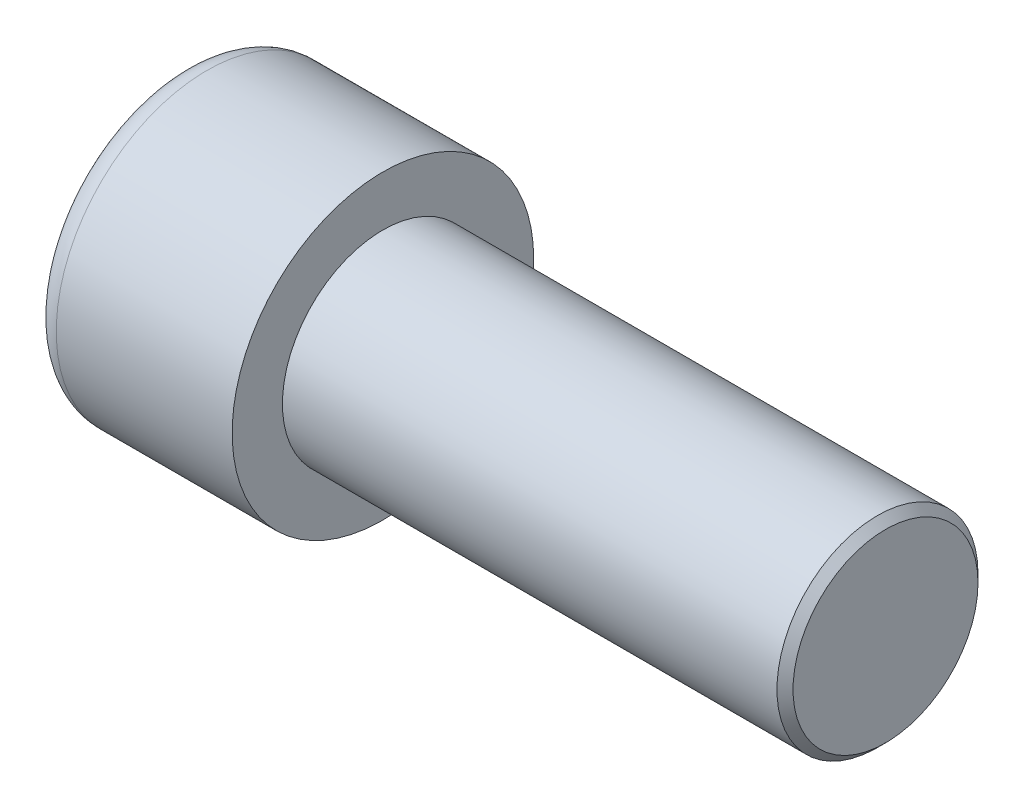
ISO-10303-21;
HEADER;
FILE_DESCRIPTION(('STEP AP214'),'2;1');
FILE_NAME('part.step','',(''),(''),'','','');
FILE_SCHEMA(('AUTOMOTIVE_DESIGN { 1 0 10303 214 1 1 1 1 }'));
ENDSEC;
DATA;
#1=APPLICATION_CONTEXT('core data for automotive mechanical design processes');
#2=APPLICATION_PROTOCOL_DEFINITION('international standard','automotive_design',2000,#1);
#3=PRODUCT_CONTEXT('',#1,'mechanical');
#4=PRODUCT('Part','Part','',(#3));
#5=PRODUCT_RELATED_PRODUCT_CATEGORY('part','',(#4));
#6=PRODUCT_DEFINITION_FORMATION('','',#4);
#7=PRODUCT_DEFINITION_CONTEXT('part definition',#1,'design');
#8=PRODUCT_DEFINITION('design','',#6,#7);
#9=PRODUCT_DEFINITION_SHAPE('','',#8);
#10=(LENGTH_UNIT() NAMED_UNIT(*) SI_UNIT(.MILLI.,.METRE.));
#11=(NAMED_UNIT(*) PLANE_ANGLE_UNIT() SI_UNIT($,.RADIAN.));
#12=(NAMED_UNIT(*) SI_UNIT($,.STERADIAN.) SOLID_ANGLE_UNIT());
#13=UNCERTAINTY_MEASURE_WITH_UNIT(LENGTH_MEASURE(1.E-05),#10,'distance_accuracy_value','');
#14=(GEOMETRIC_REPRESENTATION_CONTEXT(3) GLOBAL_UNCERTAINTY_ASSIGNED_CONTEXT((#13)) GLOBAL_UNIT_ASSIGNED_CONTEXT((#10,
#11,#12)) REPRESENTATION_CONTEXT('',''));
#15=CARTESIAN_POINT('',(0.,0.,0.));
#16=DIRECTION('',(0.,0.,1.));
#17=DIRECTION('',(1.,0.,0.));
#18=AXIS2_PLACEMENT_3D('',#15,#16,#17);
#19=CARTESIAN_POINT('',(6.14277124869768,-17.4264788643518,-0.68643311876925));
#20=DIRECTION('',(-1.,0.,0.));
#21=DIRECTION('',(0.,0.,1.));
#22=AXIS2_PLACEMENT_3D('',#19,#20,#21);
#23=PLANE('',#22);
#24=DIRECTION('',(0.,-0.866025403784438,-0.5));
#25=VECTOR('',#24,1.);
#26=CARTESIAN_POINT('',(6.14277124869768,-0.426478864351765,9.12852145745439));
#27=LINE('',#26,#25);
#28=CARTESIAN_POINT('',(6.14277124869768,-4.67647886435177,6.67478281339848));
#29=VERTEX_POINT('',#28);
#30=CARTESIAN_POINT('',(6.14277124869768,-8.92647886435176,4.22104416934257));
#31=VERTEX_POINT('',#30);
#32=EDGE_CURVE('E137',#29,#31,#27,.T.);
#33=ORIENTED_EDGE('',*,*,#32,.F.);
#34=CARTESIAN_POINT('',(6.14277124869768,-0.426478864351765,-0.686433118769258));
#35=DIRECTION('',(-1.,0.,0.));
#36=DIRECTION('',(0.,0.,1.));
#37=AXIS2_PLACEMENT_3D('',#34,#35,#36);
#38=CIRCLE('',#37,8.49999999999999);
#39=CARTESIAN_POINT('',(6.14277124869768,-8.92647886435176,-0.686433118769258));
#40=VERTEX_POINT('',#39);
#41=EDGE_CURVE('E33',#29,#40,#38,.F.);
#42=ORIENTED_EDGE('',*,*,#41,.T.);
#43=DIRECTION('',(0.,0.,-1.));
#44=VECTOR('',#43,1.);
#45=CARTESIAN_POINT('',(6.14277124869768,-8.92647886435176,4.22104416934257));
#46=LINE('',#45,#44);
#47=EDGE_CURVE('E143',#31,#40,#46,.T.);
#48=ORIENTED_EDGE('',*,*,#47,.F.);
#49=EDGE_LOOP('',(#33,#42,#48));
#50=FACE_BOUND('',#49,.T.);
#51=ADVANCED_FACE('F16',(#50),#23,.T.);
#52=CARTESIAN_POINT('',(6.14277124869768,-8.92647886435176,-5.59391040688107));
#53=VERTEX_POINT('',#52);
#54=EDGE_CURVE('E138',#40,#53,#46,.T.);
#55=ORIENTED_EDGE('',*,*,#54,.F.);
#56=CARTESIAN_POINT('',(6.14277124869768,-4.67647886435176,-8.04764905093699));
#57=VERTEX_POINT('',#56);
#58=EDGE_CURVE('E116',#40,#57,#38,.F.);
#59=ORIENTED_EDGE('',*,*,#58,.T.);
#60=DIRECTION('',(0.,0.866025403784439,-0.5));
#61=VECTOR('',#60,1.);
#62=CARTESIAN_POINT('',(6.14277124869768,-8.92647886435176,-5.59391040688107));
#63=LINE('',#62,#61);
#64=EDGE_CURVE('E123',#53,#57,#63,.T.);
#65=ORIENTED_EDGE('',*,*,#64,.F.);
#66=EDGE_LOOP('',(#55,#59,#65));
#67=FACE_BOUND('',#66,.T.);
#68=ADVANCED_FACE('F196',(#67),#23,.T.);
#69=CARTESIAN_POINT('',(6.14277124869768,-0.426478864351765,-10.5013876949929));
#70=VERTEX_POINT('',#69);
#71=EDGE_CURVE('E111',#57,#70,#63,.T.);
#72=ORIENTED_EDGE('',*,*,#71,.F.);
#73=CARTESIAN_POINT('',(6.14277124869768,3.82352113564824,-8.04764905093698));
#74=VERTEX_POINT('',#73);
#75=EDGE_CURVE('E98',#57,#74,#38,.F.);
#76=ORIENTED_EDGE('',*,*,#75,.T.);
#77=DIRECTION('',(0.,0.866025403784438,0.5));
#78=VECTOR('',#77,1.);
#79=CARTESIAN_POINT('',(6.14277124869768,-0.426478864351765,-10.5013876949929));
#80=LINE('',#79,#78);
#81=EDGE_CURVE('E115',#70,#74,#80,.T.);
#82=ORIENTED_EDGE('',*,*,#81,.F.);
#83=EDGE_LOOP('',(#72,#76,#82));
#84=FACE_BOUND('',#83,.T.);
#85=ADVANCED_FACE('F109',(#84),#23,.T.);
#86=CARTESIAN_POINT('',(6.14277124869768,8.07352113564824,-5.59391040688106));
#87=VERTEX_POINT('',#86);
#88=EDGE_CURVE('E119',#74,#87,#80,.T.);
#89=ORIENTED_EDGE('',*,*,#88,.F.);
#90=CARTESIAN_POINT('',(6.14277124869768,-0.426478864351765,-0.686433118769258));
#91=DIRECTION('',(1.,0.,0.));
#92=DIRECTION('',(0.,0.,-1.));
#93=AXIS2_PLACEMENT_3D('',#90,#91,#92);
#94=CIRCLE('',#93,8.5);
#95=CARTESIAN_POINT('',(6.14277124869768,8.07352113564823,-0.686433118769258));
#96=VERTEX_POINT('',#95);
#97=EDGE_CURVE('E96',#74,#96,#94,.T.);
#98=ORIENTED_EDGE('',*,*,#97,.T.);
#99=DIRECTION('',(0.,0.,1.));
#100=VECTOR('',#99,1.);
#101=CARTESIAN_POINT('',(6.14277124869768,8.07352113564824,-5.59391040688106));
#102=LINE('',#101,#100);
#103=EDGE_CURVE('E124',#87,#96,#102,.T.);
#104=ORIENTED_EDGE('',*,*,#103,.F.);
#105=EDGE_LOOP('',(#89,#98,#104));
#106=FACE_BOUND('',#105,.T.);
#107=ADVANCED_FACE('F118',(#106),#23,.T.);
#108=CARTESIAN_POINT('',(6.14277124869768,8.07352113564824,4.22104416934257));
#109=VERTEX_POINT('',#108);
#110=EDGE_CURVE('E128',#96,#109,#102,.T.);
#111=ORIENTED_EDGE('',*,*,#110,.F.);
#112=CARTESIAN_POINT('',(6.14277124869768,3.82352113564824,6.67478281339847));
#113=VERTEX_POINT('',#112);
#114=EDGE_CURVE('E101',#96,#113,#38,.F.);
#115=ORIENTED_EDGE('',*,*,#114,.T.);
#116=DIRECTION('',(0.,-0.866025403784439,0.5));
#117=VECTOR('',#116,1.);
#118=CARTESIAN_POINT('',(6.14277124869768,8.07352113564824,4.22104416934257));
#119=LINE('',#118,#117);
#120=EDGE_CURVE('E132',#109,#113,#119,.T.);
#121=ORIENTED_EDGE('',*,*,#120,.F.);
#122=EDGE_LOOP('',(#111,#115,#121));
#123=FACE_BOUND('',#122,.T.);
#124=ADVANCED_FACE('F209',(#123),#23,.T.);
#125=CARTESIAN_POINT('',(6.14277124869768,-0.426478864351765,9.12852145745439));
#126=VERTEX_POINT('',#125);
#127=EDGE_CURVE('E135',#113,#126,#119,.T.);
#128=ORIENTED_EDGE('',*,*,#127,.F.);
#129=EDGE_CURVE('E176',#113,#29,#38,.F.);
#130=ORIENTED_EDGE('',*,*,#129,.T.);
#131=EDGE_CURVE('E140',#126,#29,#27,.T.);
#132=ORIENTED_EDGE('',*,*,#131,.F.);
#133=EDGE_LOOP('',(#128,#130,#132));
#134=FACE_BOUND('',#133,.T.);
#135=ADVANCED_FACE('F203',(#134),#23,.T.);
#136=CARTESIAN_POINT('',(-3.85722875130232,-0.426478864351765,-0.686433118769258));
#137=DIRECTION('',(1.,0.,0.));
#138=DIRECTION('',(0.,0.,-1.));
#139=AXIS2_PLACEMENT_3D('',#136,#137,#138);
#140=PLANE('',#139);
#141=CARTESIAN_POINT('',(-3.85722875130232,-0.426478864351765,-0.686433118769258));
#142=DIRECTION('',(1.,0.,0.));
#143=DIRECTION('',(0.,0.,-1.));
#144=AXIS2_PLACEMENT_3D('',#141,#142,#143);
#145=CIRCLE('',#144,12.5);
#146=CARTESIAN_POINT('',(-3.85722875130232,-0.426478864351765,-13.1864331187693));
#147=VERTEX_POINT('',#146);
#148=EDGE_CURVE('E181',#147,#147,#145,.F.);
#149=ORIENTED_EDGE('',*,*,#148,.T.);
#150=EDGE_LOOP('',(#149));
#151=FACE_BOUND('',#150,.T.);
#152=DIRECTION('',(0.,0.866025403784439,-0.5));
#153=VECTOR('',#152,1.);
#154=CARTESIAN_POINT('',(-3.85722875130232,-8.92647886435176,-5.59391040688107));
#155=LINE('',#154,#153);
#156=CARTESIAN_POINT('',(-3.85722875130232,-8.92647886435176,-5.59391040688107));
#157=VERTEX_POINT('',#156);
#158=CARTESIAN_POINT('',(-3.85722875130232,-0.426478864351765,-10.5013876949929));
#159=VERTEX_POINT('',#158);
#160=EDGE_CURVE('E39',#157,#159,#155,.T.);
#161=ORIENTED_EDGE('',*,*,#160,.T.);
#162=DIRECTION('',(0.,0.866025403784438,0.5));
#163=VECTOR('',#162,1.);
#164=CARTESIAN_POINT('',(-3.85722875130232,-0.426478864351765,-10.5013876949929));
#165=LINE('',#164,#163);
#166=CARTESIAN_POINT('',(-3.85722875130232,8.07352113564824,-5.59391040688106));
#167=VERTEX_POINT('',#166);
#168=EDGE_CURVE('E148',#159,#167,#165,.T.);
#169=ORIENTED_EDGE('',*,*,#168,.T.);
#170=DIRECTION('',(0.,0.,1.));
#171=VECTOR('',#170,1.);
#172=CARTESIAN_POINT('',(-3.85722875130232,8.07352113564824,-5.59391040688106));
#173=LINE('',#172,#171);
#174=CARTESIAN_POINT('',(-3.85722875130232,8.07352113564824,4.22104416934257));
#175=VERTEX_POINT('',#174);
#176=EDGE_CURVE('E149',#167,#175,#173,.T.);
#177=ORIENTED_EDGE('',*,*,#176,.T.);
#178=DIRECTION('',(0.,-0.866025403784439,0.5));
#179=VECTOR('',#178,1.);
#180=CARTESIAN_POINT('',(-3.85722875130232,8.07352113564824,4.22104416934257));
#181=LINE('',#180,#179);
#182=CARTESIAN_POINT('',(-3.85722875130232,-0.426478864351765,9.12852145745439));
#183=VERTEX_POINT('',#182);
#184=EDGE_CURVE('E155',#175,#183,#181,.T.);
#185=ORIENTED_EDGE('',*,*,#184,.T.);
#186=DIRECTION('',(0.,-0.866025403784438,-0.5));
#187=VECTOR('',#186,1.);
#188=CARTESIAN_POINT('',(-3.85722875130232,-0.426478864351765,9.12852145745439));
#189=LINE('',#188,#187);
#190=CARTESIAN_POINT('',(-3.85722875130232,-8.92647886435176,4.22104416934257));
#191=VERTEX_POINT('',#190);
#192=EDGE_CURVE('E154',#183,#191,#189,.T.);
#193=ORIENTED_EDGE('',*,*,#192,.T.);
#194=DIRECTION('',(0.,0.,-1.));
#195=VECTOR('',#194,1.);
#196=CARTESIAN_POINT('',(-3.85722875130232,-8.92647886435176,4.22104416934257));
#197=LINE('',#196,#195);
#198=EDGE_CURVE('E158',#191,#157,#197,.T.);
#199=ORIENTED_EDGE('',*,*,#198,.T.);
#200=EDGE_LOOP('',(#161,#169,#177,#185,#193,#199));
#201=FACE_BOUND('',#200,.T.);
#202=ADVANCED_FACE('F207',(#151,#201),#140,.F.);
#203=CARTESIAN_POINT('',(16.1427712486977,-0.426478864351765,-0.686433118769258));
#204=DIRECTION('',(1.,0.,0.));
#205=DIRECTION('',(0.,0.,-1.));
#206=AXIS2_PLACEMENT_3D('',#203,#204,#205);
#207=PLANE('',#206);
#208=CARTESIAN_POINT('',(16.1427712486977,-0.426478864351765,-0.686433118769258));
#209=DIRECTION('',(1.,0.,0.));
#210=DIRECTION('',(0.,0.,-1.));
#211=AXIS2_PLACEMENT_3D('',#208,#209,#210);
#212=CIRCLE('',#211,15.);
#213=CARTESIAN_POINT('',(16.1427712486977,-0.426478864351765,-15.6864331187693));
#214=VERTEX_POINT('',#213);
#215=EDGE_CURVE('E173',#214,#214,#212,.T.);
#216=ORIENTED_EDGE('',*,*,#215,.T.);
#217=EDGE_LOOP('',(#216));
#218=FACE_BOUND('',#217,.T.);
#219=CARTESIAN_POINT('',(16.1427712486977,-0.426478864351765,-0.686433118769258));
#220=DIRECTION('',(1.,0.,0.));
#221=DIRECTION('',(0.,0.,-1.));
#222=AXIS2_PLACEMENT_3D('',#219,#220,#221);
#223=CIRCLE('',#222,10.);
#224=CARTESIAN_POINT('',(16.1427712486977,-0.426478864351765,-10.6864331187693));
#225=VERTEX_POINT('',#224);
#226=EDGE_CURVE('E171',#225,#225,#223,.T.);
#227=ORIENTED_EDGE('',*,*,#226,.F.);
#228=EDGE_LOOP('',(#227));
#229=FACE_BOUND('',#228,.T.);
#230=ADVANCED_FACE('F216',(#218,#229),#207,.T.);
#231=CARTESIAN_POINT('',(16.1427712486977,-0.426478864351765,-0.686433118769258));
#232=DIRECTION('',(-1.,0.,0.));
#233=DIRECTION('',(0.,0.,1.));
#234=AXIS2_PLACEMENT_3D('',#231,#232,#233);
#235=CYLINDRICAL_SURFACE('',#234,15.);
#236=CARTESIAN_POINT('',(-1.35722875130232,-0.426478864351765,-0.686433118769258));
#237=DIRECTION('',(1.,0.,0.));
#238=DIRECTION('',(0.,0.,-1.));
#239=AXIS2_PLACEMENT_3D('',#236,#237,#238);
#240=CIRCLE('',#239,15.);
#241=CARTESIAN_POINT('',(-1.35722875130232,-0.426478864351765,-15.6864331187693));
#242=VERTEX_POINT('',#241);
#243=EDGE_CURVE('E178',#242,#242,#240,.T.);
#244=ORIENTED_EDGE('',*,*,#243,.T.);
#245=EDGE_LOOP('',(#244));
#246=FACE_BOUND('',#245,.T.);
#247=ORIENTED_EDGE('',*,*,#215,.F.);
#248=EDGE_LOOP('',(#247));
#249=FACE_BOUND('',#248,.T.);
#250=ADVANCED_FACE('F261',(#246,#249),#235,.T.);
#251=CARTESIAN_POINT('',(66.1427712486977,-0.426478864351765,-0.686433118769258));
#252=DIRECTION('',(-1.,0.,0.));
#253=DIRECTION('',(0.,0.,1.));
#254=AXIS2_PLACEMENT_3D('',#251,#252,#253);
#255=CYLINDRICAL_SURFACE('',#254,10.);
#256=CARTESIAN_POINT('',(65.3427712486977,-0.426478864351765,-0.686433118769258));
#257=DIRECTION('',(1.,0.,0.));
#258=DIRECTION('',(0.,0.,-1.));
#259=AXIS2_PLACEMENT_3D('',#256,#257,#258);
#260=CIRCLE('',#259,10.);
#261=CARTESIAN_POINT('',(65.3427712486977,-0.426478864351765,-10.6864331187693));
#262=VERTEX_POINT('',#261);
#263=EDGE_CURVE('E10',#262,#262,#260,.F.);
#264=ORIENTED_EDGE('',*,*,#263,.T.);
#265=EDGE_LOOP('',(#264));
#266=FACE_BOUND('',#265,.T.);
#267=ORIENTED_EDGE('',*,*,#226,.T.);
#268=EDGE_LOOP('',(#267));
#269=FACE_BOUND('',#268,.T.);
#270=ADVANCED_FACE('F256',(#266,#269),#255,.T.);
#271=CARTESIAN_POINT('',(66.1427712486977,-0.426478864351765,-0.686433118769258));
#272=DIRECTION('',(1.,0.,0.));
#273=DIRECTION('',(0.,0.,-1.));
#274=AXIS2_PLACEMENT_3D('',#271,#272,#273);
#275=PLANE('',#274);
#276=CARTESIAN_POINT('',(66.1427712486977,-0.426478864351765,-0.686433118769258));
#277=DIRECTION('',(1.,0.,0.));
#278=DIRECTION('',(0.,0.,-1.));
#279=AXIS2_PLACEMENT_3D('',#276,#277,#278);
#280=CIRCLE('',#279,9.20000000000001);
#281=CARTESIAN_POINT('',(66.1427712486977,-0.426478864351765,-9.88643311876926));
#282=VERTEX_POINT('',#281);
#283=EDGE_CURVE('E24',#282,#282,#280,.T.);
#284=ORIENTED_EDGE('',*,*,#283,.T.);
#285=EDGE_LOOP('',(#284));
#286=FACE_BOUND('',#285,.T.);
#287=ADVANCED_FACE('F190',(#286),#275,.T.);
#288=CARTESIAN_POINT('',(6.14277124869768,-8.92647886435176,-5.59391040688107));
#289=DIRECTION('',(0.,0.5,0.866025403784439));
#290=DIRECTION('',(0.,-0.866025403784439,0.5));
#291=AXIS2_PLACEMENT_3D('',#288,#289,#290);
#292=PLANE('',#291);
#293=ORIENTED_EDGE('',*,*,#160,.F.);
#294=DIRECTION('',(-1.,0.,0.));
#295=VECTOR('',#294,1.);
#296=CARTESIAN_POINT('',(6.14277124869768,-8.92647886435176,-5.59391040688107));
#297=LINE('',#296,#295);
#298=EDGE_CURVE('E145',#53,#157,#297,.T.);
#299=ORIENTED_EDGE('',*,*,#298,.F.);
#300=ORIENTED_EDGE('',*,*,#64,.T.);
#301=ORIENTED_EDGE('',*,*,#71,.T.);
#302=DIRECTION('',(-1.,0.,0.));
#303=VECTOR('',#302,1.);
#304=CARTESIAN_POINT('',(6.14277124869768,-0.426478864351765,-10.5013876949929));
#305=LINE('',#304,#303);
#306=EDGE_CURVE('E126',#70,#159,#305,.T.);
#307=ORIENTED_EDGE('',*,*,#306,.T.);
#308=EDGE_LOOP('',(#293,#299,#300,#301,#307));
#309=FACE_BOUND('',#308,.T.);
#310=ADVANCED_FACE('F231',(#309),#292,.T.);
#311=CARTESIAN_POINT('',(6.14277124869768,-0.426478864351765,-10.5013876949929));
#312=DIRECTION('',(0.,-0.5,0.866025403784438));
#313=DIRECTION('',(0.,-0.866025403784439,-0.5));
#314=AXIS2_PLACEMENT_3D('',#311,#312,#313);
#315=PLANE('',#314);
#316=ORIENTED_EDGE('',*,*,#168,.F.);
#317=ORIENTED_EDGE('',*,*,#306,.F.);
#318=ORIENTED_EDGE('',*,*,#81,.T.);
#319=ORIENTED_EDGE('',*,*,#88,.T.);
#320=DIRECTION('',(-1.,0.,0.));
#321=VECTOR('',#320,1.);
#322=CARTESIAN_POINT('',(6.14277124869768,8.07352113564824,-5.59391040688106));
#323=LINE('',#322,#321);
#324=EDGE_CURVE('E169',#87,#167,#323,.T.);
#325=ORIENTED_EDGE('',*,*,#324,.T.);
#326=EDGE_LOOP('',(#316,#317,#318,#319,#325));
#327=FACE_BOUND('',#326,.T.);
#328=ADVANCED_FACE('F130',(#327),#315,.T.);
#329=CARTESIAN_POINT('',(6.14277124869768,8.07352113564824,-5.59391040688106));
#330=DIRECTION('',(0.,-1.,0.));
#331=DIRECTION('',(0.,0.,-1.));
#332=AXIS2_PLACEMENT_3D('',#329,#330,#331);
#333=PLANE('',#332);
#334=ORIENTED_EDGE('',*,*,#176,.F.);
#335=ORIENTED_EDGE('',*,*,#324,.F.);
#336=ORIENTED_EDGE('',*,*,#103,.T.);
#337=ORIENTED_EDGE('',*,*,#110,.T.);
#338=DIRECTION('',(-1.,0.,0.));
#339=VECTOR('',#338,1.);
#340=CARTESIAN_POINT('',(6.14277124869768,8.07352113564824,4.22104416934257));
#341=LINE('',#340,#339);
#342=EDGE_CURVE('E167',#109,#175,#341,.T.);
#343=ORIENTED_EDGE('',*,*,#342,.T.);
#344=EDGE_LOOP('',(#334,#335,#336,#337,#343));
#345=FACE_BOUND('',#344,.T.);
#346=ADVANCED_FACE('F230',(#345),#333,.T.);
#347=CARTESIAN_POINT('',(6.14277124869768,8.07352113564824,4.22104416934257));
#348=DIRECTION('',(0.,-0.5,-0.866025403784438));
#349=DIRECTION('',(0.,0.866025403784439,-0.5));
#350=AXIS2_PLACEMENT_3D('',#347,#348,#349);
#351=PLANE('',#350);
#352=ORIENTED_EDGE('',*,*,#184,.F.);
#353=ORIENTED_EDGE('',*,*,#342,.F.);
#354=ORIENTED_EDGE('',*,*,#120,.T.);
#355=ORIENTED_EDGE('',*,*,#127,.T.);
#356=DIRECTION('',(-1.,0.,0.));
#357=VECTOR('',#356,1.);
#358=CARTESIAN_POINT('',(6.14277124869768,-0.426478864351765,9.12852145745439));
#359=LINE('',#358,#357);
#360=EDGE_CURVE('E163',#126,#183,#359,.T.);
#361=ORIENTED_EDGE('',*,*,#360,.T.);
#362=EDGE_LOOP('',(#352,#353,#354,#355,#361));
#363=FACE_BOUND('',#362,.T.);
#364=ADVANCED_FACE('F227',(#363),#351,.T.);
#365=CARTESIAN_POINT('',(6.14277124869768,-0.426478864351765,9.12852145745439));
#366=DIRECTION('',(0.,0.5,-0.866025403784438));
#367=DIRECTION('',(0.,0.866025403784438,0.5));
#368=AXIS2_PLACEMENT_3D('',#365,#366,#367);
#369=PLANE('',#368);
#370=ORIENTED_EDGE('',*,*,#192,.F.);
#371=ORIENTED_EDGE('',*,*,#360,.F.);
#372=ORIENTED_EDGE('',*,*,#131,.T.);
#373=ORIENTED_EDGE('',*,*,#32,.T.);
#374=DIRECTION('',(-1.,0.,0.));
#375=VECTOR('',#374,1.);
#376=CARTESIAN_POINT('',(6.14277124869768,-8.92647886435176,4.22104416934257));
#377=LINE('',#376,#375);
#378=EDGE_CURVE('E165',#31,#191,#377,.T.);
#379=ORIENTED_EDGE('',*,*,#378,.T.);
#380=EDGE_LOOP('',(#370,#371,#372,#373,#379));
#381=FACE_BOUND('',#380,.T.);
#382=ADVANCED_FACE('F241',(#381),#369,.T.);
#383=CARTESIAN_POINT('',(6.14277124869768,-8.92647886435176,4.22104416934257));
#384=DIRECTION('',(0.,1.,0.));
#385=DIRECTION('',(0.,0.,1.));
#386=AXIS2_PLACEMENT_3D('',#383,#384,#385);
#387=PLANE('',#386);
#388=ORIENTED_EDGE('',*,*,#198,.F.);
#389=ORIENTED_EDGE('',*,*,#378,.F.);
#390=ORIENTED_EDGE('',*,*,#47,.T.);
#391=ORIENTED_EDGE('',*,*,#54,.T.);
#392=ORIENTED_EDGE('',*,*,#298,.T.);
#393=EDGE_LOOP('',(#388,#389,#390,#391,#392));
#394=FACE_BOUND('',#393,.T.);
#395=ADVANCED_FACE('F91',(#394),#387,.T.);
#396=CARTESIAN_POINT('',(6.14277124869768,-0.426478864351765,-0.686433118769258));
#397=DIRECTION('',(-1.,0.,0.));
#398=DIRECTION('',(0.,0.,1.));
#399=AXIS2_PLACEMENT_3D('',#396,#397,#398);
#400=CONICAL_SURFACE('',#399,8.5,1.04719755119659);
#401=CARTESIAN_POINT('',(11.0502485368096,-0.426478864351765,-0.686433118769258));
#402=VERTEX_POINT('',#401);
#403=VERTEX_LOOP('',#402);
#404=FACE_BOUND('',#403,.T.);
#405=ORIENTED_EDGE('',*,*,#97,.F.);
#406=ORIENTED_EDGE('',*,*,#75,.F.);
#407=ORIENTED_EDGE('',*,*,#58,.F.);
#408=ORIENTED_EDGE('',*,*,#41,.F.);
#409=ORIENTED_EDGE('',*,*,#129,.F.);
#410=ORIENTED_EDGE('',*,*,#114,.F.);
#411=EDGE_LOOP('',(#405,#406,#407,#408,#409,#410));
#412=FACE_BOUND('',#411,.T.);
#413=ADVANCED_FACE('F89',(#404,#412),#400,.F.);
#414=CARTESIAN_POINT('',(-1.35722875130232,-0.426478864351765,-0.686433118769258));
#415=DIRECTION('',(1.,0.,0.));
#416=DIRECTION('',(0.,0.,-1.));
#417=AXIS2_PLACEMENT_3D('',#414,#415,#416);
#418=TOROIDAL_SURFACE('',#417,12.5,2.5);
#419=ORIENTED_EDGE('',*,*,#148,.F.);
#420=EDGE_LOOP('',(#419));
#421=FACE_BOUND('',#420,.T.);
#422=ORIENTED_EDGE('',*,*,#243,.F.);
#423=EDGE_LOOP('',(#422));
#424=FACE_BOUND('',#423,.T.);
#425=ADVANCED_FACE('F95',(#421,#424),#418,.T.);
#426=CARTESIAN_POINT('',(66.1427712486977,-0.426478864351765,-0.686433118769258));
#427=DIRECTION('',(-1.,0.,0.));
#428=DIRECTION('',(0.,0.,1.));
#429=AXIS2_PLACEMENT_3D('',#426,#427,#428);
#430=CONICAL_SURFACE('',#429,9.20000000000001,0.785398163397439);
#431=ORIENTED_EDGE('',*,*,#263,.F.);
#432=EDGE_LOOP('',(#431));
#433=FACE_BOUND('',#432,.T.);
#434=ORIENTED_EDGE('',*,*,#283,.F.);
#435=EDGE_LOOP('',(#434));
#436=FACE_BOUND('',#435,.T.);
#437=ADVANCED_FACE('F18',(#433,#436),#430,.T.);
#438=CLOSED_SHELL('',(#51,#68,#85,#107,#124,#135,#202,#230,#250,#270,#287,#310,#328,#346,#364,
#382,#395,#413,#425,#437));
#439=MANIFOLD_SOLID_BREP('B1',#438);
#440=ADVANCED_BREP_SHAPE_REPRESENTATION('',(#18,#439),#14);
#441=SHAPE_DEFINITION_REPRESENTATION(#9,#440);
ENDSEC;
END-ISO-10303-21;
